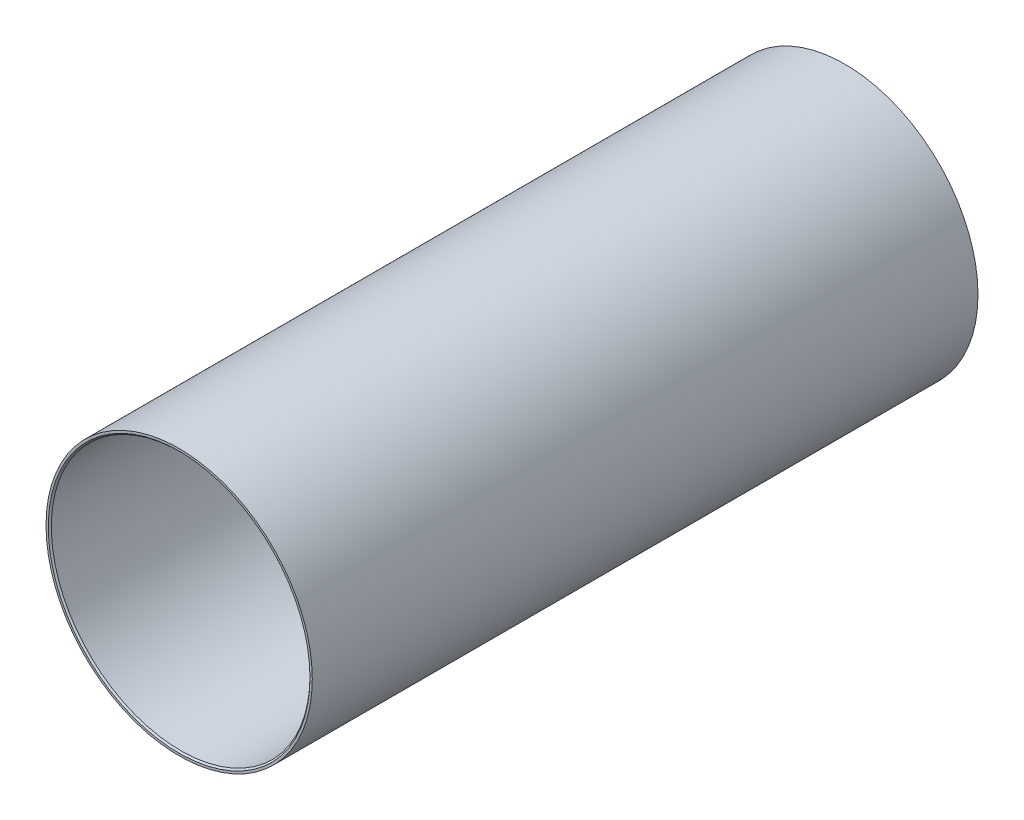
ISO-10303-21;
HEADER;
FILE_DESCRIPTION(('STEP AP214'),'2;1');
FILE_NAME('part.step','',(''),(''),'','','');
FILE_SCHEMA(('AUTOMOTIVE_DESIGN { 1 0 10303 214 1 1 1 1 }'));
ENDSEC;
DATA;
#1=APPLICATION_CONTEXT('core data for automotive mechanical design processes');
#2=APPLICATION_PROTOCOL_DEFINITION('international standard','automotive_design',2000,#1);
#3=PRODUCT_CONTEXT('',#1,'mechanical');
#4=PRODUCT('Part','Part','',(#3));
#5=PRODUCT_RELATED_PRODUCT_CATEGORY('part','',(#4));
#6=PRODUCT_DEFINITION_FORMATION('','',#4);
#7=PRODUCT_DEFINITION_CONTEXT('part definition',#1,'design');
#8=PRODUCT_DEFINITION('design','',#6,#7);
#9=PRODUCT_DEFINITION_SHAPE('','',#8);
#10=(LENGTH_UNIT() NAMED_UNIT(*) SI_UNIT(.MILLI.,.METRE.));
#11=(NAMED_UNIT(*) PLANE_ANGLE_UNIT() SI_UNIT($,.RADIAN.));
#12=(NAMED_UNIT(*) SI_UNIT($,.STERADIAN.) SOLID_ANGLE_UNIT());
#13=UNCERTAINTY_MEASURE_WITH_UNIT(LENGTH_MEASURE(1.E-05),#10,'distance_accuracy_value','');
#14=(GEOMETRIC_REPRESENTATION_CONTEXT(3) GLOBAL_UNCERTAINTY_ASSIGNED_CONTEXT((#13)) GLOBAL_UNIT_ASSIGNED_CONTEXT((#10,
#11,#12)) REPRESENTATION_CONTEXT('',''));
#15=CARTESIAN_POINT('',(0.,0.,0.));
#16=DIRECTION('',(0.,0.,1.));
#17=DIRECTION('',(1.,0.,0.));
#18=AXIS2_PLACEMENT_3D('',#15,#16,#17);
#19=CARTESIAN_POINT('',(0.,0.,87.5));
#20=DIRECTION('',(0.,0.,1.));
#21=DIRECTION('',(1.,0.,0.));
#22=AXIS2_PLACEMENT_3D('',#19,#20,#21);
#23=PLANE('',#22);
#24=CARTESIAN_POINT('',(0.,0.,87.5));
#25=DIRECTION('',(0.,0.,1.));
#26=DIRECTION('',(1.,0.,0.));
#27=AXIS2_PLACEMENT_3D('',#24,#25,#26);
#28=CIRCLE('',#27,17.2);
#29=CARTESIAN_POINT('',(17.2,0.,87.5));
#30=VERTEX_POINT('',#29);
#31=EDGE_CURVE('E10',#30,#30,#28,.F.);
#32=ORIENTED_EDGE('',*,*,#31,.T.);
#33=EDGE_LOOP('',(#32));
#34=FACE_BOUND('',#33,.T.);
#35=CARTESIAN_POINT('',(0.,0.,87.5));
#36=DIRECTION('',(0.,0.,1.));
#37=DIRECTION('',(1.,0.,0.));
#38=AXIS2_PLACEMENT_3D('',#35,#36,#37);
#39=CIRCLE('',#38,17.5);
#40=CARTESIAN_POINT('',(17.5,0.,87.5));
#41=VERTEX_POINT('',#40);
#42=EDGE_CURVE('E54',#41,#41,#39,.T.);
#43=ORIENTED_EDGE('',*,*,#42,.T.);
#44=EDGE_LOOP('',(#43));
#45=FACE_BOUND('',#44,.T.);
#46=ADVANCED_FACE('F33',(#34,#45),#23,.T.);
#47=CARTESIAN_POINT('',(0.,0.,0.));
#48=DIRECTION('',(0.,0.,1.));
#49=DIRECTION('',(1.,0.,0.));
#50=AXIS2_PLACEMENT_3D('',#47,#48,#49);
#51=PLANE('',#50);
#52=CARTESIAN_POINT('',(0.,0.,0.));
#53=DIRECTION('',(0.,0.,1.));
#54=DIRECTION('',(1.,0.,0.));
#55=AXIS2_PLACEMENT_3D('',#52,#53,#54);
#56=CIRCLE('',#55,17.2);
#57=CARTESIAN_POINT('',(17.2,0.,0.));
#58=VERTEX_POINT('',#57);
#59=EDGE_CURVE('E49',#58,#58,#56,.T.);
#60=ORIENTED_EDGE('',*,*,#59,.T.);
#61=EDGE_LOOP('',(#60));
#62=FACE_BOUND('',#61,.T.);
#63=CARTESIAN_POINT('',(0.,0.,0.));
#64=DIRECTION('',(0.,0.,1.));
#65=DIRECTION('',(1.,0.,0.));
#66=AXIS2_PLACEMENT_3D('',#63,#64,#65);
#67=CIRCLE('',#66,17.5);
#68=CARTESIAN_POINT('',(17.5,0.,0.));
#69=VERTEX_POINT('',#68);
#70=EDGE_CURVE('E55',#69,#69,#67,.T.);
#71=ORIENTED_EDGE('',*,*,#70,.F.);
#72=EDGE_LOOP('',(#71));
#73=FACE_BOUND('',#72,.T.);
#74=ADVANCED_FACE('F66',(#62,#73),#51,.F.);
#75=CARTESIAN_POINT('',(0.,0.,87.5));
#76=DIRECTION('',(0.,0.,-1.));
#77=DIRECTION('',(-1.,0.,0.));
#78=AXIS2_PLACEMENT_3D('',#75,#76,#77);
#79=CYLINDRICAL_SURFACE('',#78,17.5);
#80=ORIENTED_EDGE('',*,*,#42,.F.);
#81=EDGE_LOOP('',(#80));
#82=FACE_BOUND('',#81,.T.);
#83=ORIENTED_EDGE('',*,*,#70,.T.);
#84=EDGE_LOOP('',(#83));
#85=FACE_BOUND('',#84,.T.);
#86=ADVANCED_FACE('F62',(#82,#85),#79,.T.);
#87=CARTESIAN_POINT('',(0.,0.,87.5));
#88=DIRECTION('',(0.,0.,-1.));
#89=DIRECTION('',(-1.,0.,0.));
#90=AXIS2_PLACEMENT_3D('',#87,#88,#89);
#91=CYLINDRICAL_SURFACE('',#90,17.);
#92=CARTESIAN_POINT('',(0.,0.,0.20000000000002));
#93=DIRECTION('',(0.,0.,1.));
#94=DIRECTION('',(1.,0.,0.));
#95=AXIS2_PLACEMENT_3D('',#92,#93,#94);
#96=CIRCLE('',#95,17.);
#97=CARTESIAN_POINT('',(17.,0.,0.20000000000002));
#98=VERTEX_POINT('',#97);
#99=EDGE_CURVE('E41',#98,#98,#96,.F.);
#100=ORIENTED_EDGE('',*,*,#99,.T.);
#101=EDGE_LOOP('',(#100));
#102=FACE_BOUND('',#101,.T.);
#103=CARTESIAN_POINT('',(0.,0.,87.3));
#104=DIRECTION('',(0.,0.,1.));
#105=DIRECTION('',(1.,0.,0.));
#106=AXIS2_PLACEMENT_3D('',#103,#104,#105);
#107=CIRCLE('',#106,17.);
#108=CARTESIAN_POINT('',(17.,0.,87.3));
#109=VERTEX_POINT('',#108);
#110=EDGE_CURVE('E45',#109,#109,#107,.T.);
#111=ORIENTED_EDGE('',*,*,#110,.T.);
#112=EDGE_LOOP('',(#111));
#113=FACE_BOUND('',#112,.T.);
#114=ADVANCED_FACE('F65',(#102,#113),#91,.F.);
#115=CARTESIAN_POINT('',(0.,0.,0.));
#116=DIRECTION('',(0.,0.,-1.));
#117=DIRECTION('',(-1.,0.,0.));
#118=AXIS2_PLACEMENT_3D('',#115,#116,#117);
#119=CONICAL_SURFACE('',#118,17.2,0.785398163397414);
#120=ORIENTED_EDGE('',*,*,#99,.F.);
#121=EDGE_LOOP('',(#120));
#122=FACE_BOUND('',#121,.T.);
#123=ORIENTED_EDGE('',*,*,#59,.F.);
#124=EDGE_LOOP('',(#123));
#125=FACE_BOUND('',#124,.T.);
#126=ADVANCED_FACE('F79',(#122,#125),#119,.F.);
#127=CARTESIAN_POINT('',(0.,0.,87.3));
#128=DIRECTION('',(0.,0.,1.));
#129=DIRECTION('',(1.,0.,0.));
#130=AXIS2_PLACEMENT_3D('',#127,#128,#129);
#131=CONICAL_SURFACE('',#130,17.,0.785398163397448);
#132=ORIENTED_EDGE('',*,*,#31,.F.);
#133=EDGE_LOOP('',(#132));
#134=FACE_BOUND('',#133,.T.);
#135=ORIENTED_EDGE('',*,*,#110,.F.);
#136=EDGE_LOOP('',(#135));
#137=FACE_BOUND('',#136,.T.);
#138=ADVANCED_FACE('F36',(#134,#137),#131,.F.);
#139=CLOSED_SHELL('',(#46,#74,#86,#114,#126,#138));
#140=MANIFOLD_SOLID_BREP('B2',#139);
#141=ADVANCED_BREP_SHAPE_REPRESENTATION('',(#18,#140),#14);
#142=SHAPE_DEFINITION_REPRESENTATION(#9,#141);
ENDSEC;
END-ISO-10303-21;
